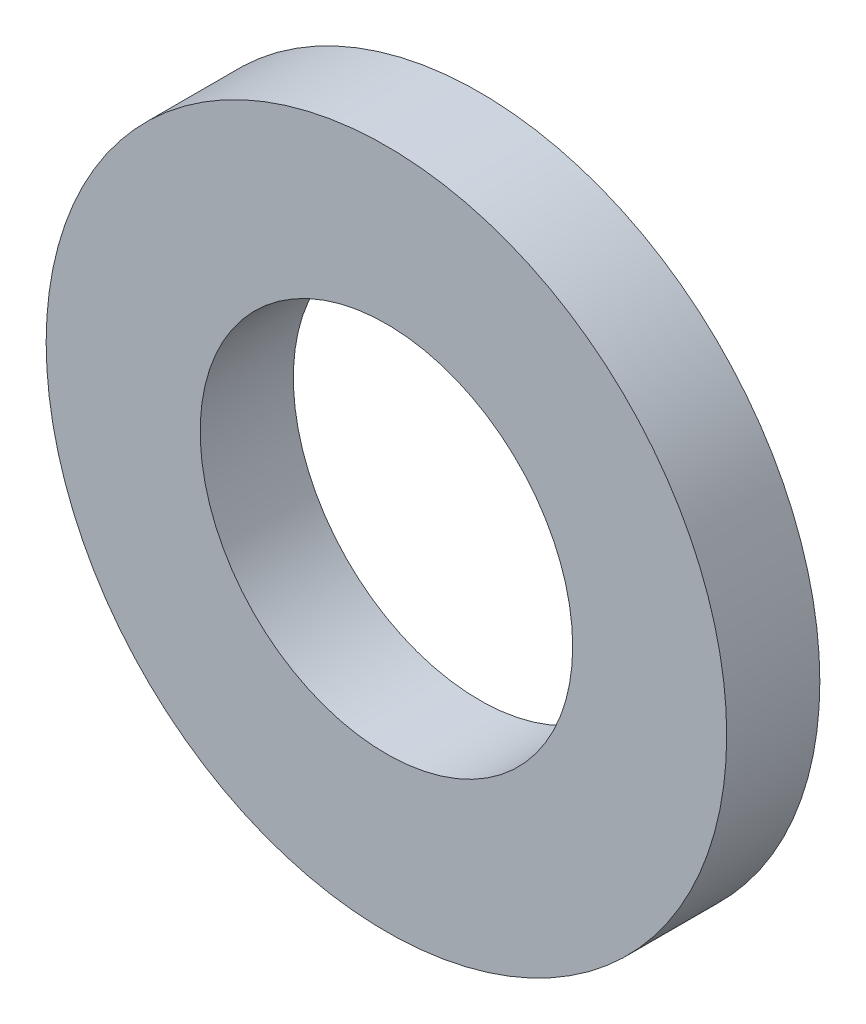
ISO-10303-21;
HEADER;
FILE_DESCRIPTION(('STEP AP214'),'2;1');
FILE_NAME('part.step','',(''),(''),'','','');
FILE_SCHEMA(('AUTOMOTIVE_DESIGN { 1 0 10303 214 1 1 1 1 }'));
ENDSEC;
DATA;
#1=APPLICATION_CONTEXT('core data for automotive mechanical design processes');
#2=APPLICATION_PROTOCOL_DEFINITION('international standard','automotive_design',2000,#1);
#3=PRODUCT_CONTEXT('',#1,'mechanical');
#4=PRODUCT('Part','Part','',(#3));
#5=PRODUCT_RELATED_PRODUCT_CATEGORY('part','',(#4));
#6=PRODUCT_DEFINITION_FORMATION('','',#4);
#7=PRODUCT_DEFINITION_CONTEXT('part definition',#1,'design');
#8=PRODUCT_DEFINITION('design','',#6,#7);
#9=PRODUCT_DEFINITION_SHAPE('','',#8);
#10=(LENGTH_UNIT() NAMED_UNIT(*) SI_UNIT(.MILLI.,.METRE.));
#11=(NAMED_UNIT(*) PLANE_ANGLE_UNIT() SI_UNIT($,.RADIAN.));
#12=(NAMED_UNIT(*) SI_UNIT($,.STERADIAN.) SOLID_ANGLE_UNIT());
#13=UNCERTAINTY_MEASURE_WITH_UNIT(LENGTH_MEASURE(1.E-05),#10,'distance_accuracy_value','');
#14=(GEOMETRIC_REPRESENTATION_CONTEXT(3) GLOBAL_UNCERTAINTY_ASSIGNED_CONTEXT((#13)) GLOBAL_UNIT_ASSIGNED_CONTEXT((#10,
#11,#12)) REPRESENTATION_CONTEXT('',''));
#15=CARTESIAN_POINT('',(0.,0.,0.));
#16=DIRECTION('',(0.,0.,1.));
#17=DIRECTION('',(1.,0.,0.));
#18=AXIS2_PLACEMENT_3D('',#15,#16,#17);
#19=CARTESIAN_POINT('',(0.,0.,0.));
#20=DIRECTION('',(0.,0.,1.));
#21=DIRECTION('',(1.,0.,0.));
#22=AXIS2_PLACEMENT_3D('',#19,#20,#21);
#23=PLANE('',#22);
#24=CARTESIAN_POINT('',(0.,0.,0.));
#25=DIRECTION('',(0.,0.,1.));
#26=DIRECTION('',(1.,0.,0.));
#27=AXIS2_PLACEMENT_3D('',#24,#25,#26);
#28=CIRCLE('',#27,2.6);
#29=CARTESIAN_POINT('',(2.6,0.,0.));
#30=VERTEX_POINT('',#29);
#31=EDGE_CURVE('E11',#30,#30,#28,.T.);
#32=ORIENTED_EDGE('',*,*,#31,.T.);
#33=EDGE_LOOP('',(#32));
#34=FACE_BOUND('',#33,.T.);
#35=CARTESIAN_POINT('',(0.,0.,0.));
#36=DIRECTION('',(0.,0.,1.));
#37=DIRECTION('',(1.,0.,0.));
#38=AXIS2_PLACEMENT_3D('',#35,#36,#37);
#39=CIRCLE('',#38,4.75);
#40=CARTESIAN_POINT('',(4.75,0.,0.));
#41=VERTEX_POINT('',#40);
#42=EDGE_CURVE('E51',#41,#41,#39,.T.);
#43=ORIENTED_EDGE('',*,*,#42,.F.);
#44=EDGE_LOOP('',(#43));
#45=FACE_BOUND('',#44,.T.);
#46=ADVANCED_FACE('F16',(#34,#45),#23,.F.);
#47=CARTESIAN_POINT('',(0.,0.,1.3));
#48=DIRECTION('',(0.,0.,1.));
#49=DIRECTION('',(1.,0.,0.));
#50=AXIS2_PLACEMENT_3D('',#47,#48,#49);
#51=PLANE('',#50);
#52=CARTESIAN_POINT('',(0.,0.,1.3));
#53=DIRECTION('',(0.,0.,1.));
#54=DIRECTION('',(1.,0.,0.));
#55=AXIS2_PLACEMENT_3D('',#52,#53,#54);
#56=CIRCLE('',#55,2.6);
#57=CARTESIAN_POINT('',(2.6,0.,1.3));
#58=VERTEX_POINT('',#57);
#59=EDGE_CURVE('E26',#58,#58,#56,.T.);
#60=ORIENTED_EDGE('',*,*,#59,.F.);
#61=EDGE_LOOP('',(#60));
#62=FACE_BOUND('',#61,.T.);
#63=CARTESIAN_POINT('',(0.,0.,1.3));
#64=DIRECTION('',(0.,0.,1.));
#65=DIRECTION('',(1.,0.,0.));
#66=AXIS2_PLACEMENT_3D('',#63,#64,#65);
#67=CIRCLE('',#66,4.75);
#68=CARTESIAN_POINT('',(4.75,0.,1.3));
#69=VERTEX_POINT('',#68);
#70=EDGE_CURVE('E19',#69,#69,#67,.T.);
#71=ORIENTED_EDGE('',*,*,#70,.T.);
#72=EDGE_LOOP('',(#71));
#73=FACE_BOUND('',#72,.T.);
#74=ADVANCED_FACE('F72',(#62,#73),#51,.T.);
#75=CARTESIAN_POINT('',(0.,0.,1.3));
#76=DIRECTION('',(0.,0.,-1.));
#77=DIRECTION('',(-1.,0.,0.));
#78=AXIS2_PLACEMENT_3D('',#75,#76,#77);
#79=CYLINDRICAL_SURFACE('',#78,2.6);
#80=ORIENTED_EDGE('',*,*,#31,.F.);
#81=EDGE_LOOP('',(#80));
#82=FACE_BOUND('',#81,.T.);
#83=ORIENTED_EDGE('',*,*,#59,.T.);
#84=EDGE_LOOP('',(#83));
#85=FACE_BOUND('',#84,.T.);
#86=ADVANCED_FACE('F77',(#82,#85),#79,.F.);
#87=CARTESIAN_POINT('',(0.,0.,1.3));
#88=DIRECTION('',(0.,0.,-1.));
#89=DIRECTION('',(-1.,0.,0.));
#90=AXIS2_PLACEMENT_3D('',#87,#88,#89);
#91=CYLINDRICAL_SURFACE('',#90,4.75);
#92=ORIENTED_EDGE('',*,*,#42,.T.);
#93=EDGE_LOOP('',(#92));
#94=FACE_BOUND('',#93,.T.);
#95=ORIENTED_EDGE('',*,*,#70,.F.);
#96=EDGE_LOOP('',(#95));
#97=FACE_BOUND('',#96,.T.);
#98=ADVANCED_FACE('F52',(#94,#97),#91,.T.);
#99=CLOSED_SHELL('',(#46,#74,#86,#98));
#100=MANIFOLD_SOLID_BREP('B1',#99);
#101=ADVANCED_BREP_SHAPE_REPRESENTATION('',(#18,#100),#14);
#102=SHAPE_DEFINITION_REPRESENTATION(#9,#101);
ENDSEC;
END-ISO-10303-21;
